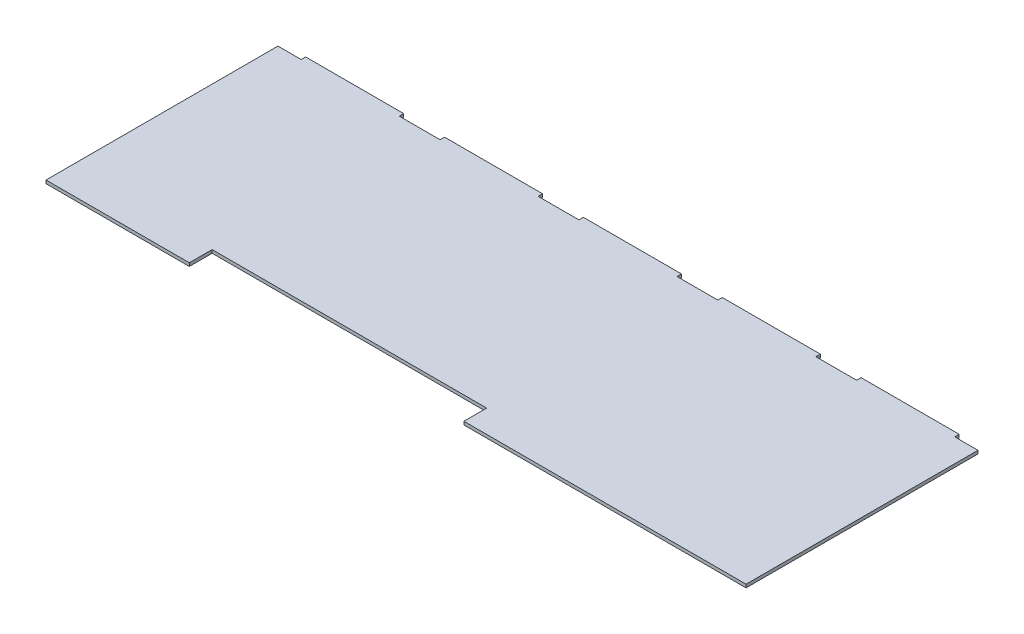
ISO-10303-21;
HEADER;
FILE_DESCRIPTION(('STEP AP214'),'2;1');
FILE_NAME('part.step','',(''),(''),'','','');
FILE_SCHEMA(('AUTOMOTIVE_DESIGN { 1 0 10303 214 1 1 1 1 }'));
ENDSEC;
DATA;
#1=APPLICATION_CONTEXT('core data for automotive mechanical design processes');
#2=APPLICATION_PROTOCOL_DEFINITION('international standard','automotive_design',2000,#1);
#3=PRODUCT_CONTEXT('',#1,'mechanical');
#4=PRODUCT('Part','Part','',(#3));
#5=PRODUCT_RELATED_PRODUCT_CATEGORY('part','',(#4));
#6=PRODUCT_DEFINITION_FORMATION('','',#4);
#7=PRODUCT_DEFINITION_CONTEXT('part definition',#1,'design');
#8=PRODUCT_DEFINITION('design','',#6,#7);
#9=PRODUCT_DEFINITION_SHAPE('','',#8);
#10=(LENGTH_UNIT() NAMED_UNIT(*) SI_UNIT(.MILLI.,.METRE.));
#11=(NAMED_UNIT(*) PLANE_ANGLE_UNIT() SI_UNIT($,.RADIAN.));
#12=(NAMED_UNIT(*) SI_UNIT($,.STERADIAN.) SOLID_ANGLE_UNIT());
#13=UNCERTAINTY_MEASURE_WITH_UNIT(LENGTH_MEASURE(1.E-05),#10,'distance_accuracy_value','');
#14=(GEOMETRIC_REPRESENTATION_CONTEXT(3) GLOBAL_UNCERTAINTY_ASSIGNED_CONTEXT((#13)) GLOBAL_UNIT_ASSIGNED_CONTEXT((#10,
#11,#12)) REPRESENTATION_CONTEXT('',''));
#15=CARTESIAN_POINT('',(0.,0.,0.));
#16=DIRECTION('',(0.,0.,1.));
#17=DIRECTION('',(1.,0.,0.));
#18=AXIS2_PLACEMENT_3D('',#15,#16,#17);
#19=CARTESIAN_POINT('',(-249.174,1.143,82.55));
#20=DIRECTION('',(0.,0.,-1.));
#21=DIRECTION('',(-1.,0.,0.));
#22=AXIS2_PLACEMENT_3D('',#19,#20,#21);
#23=PLANE('',#22);
#24=DIRECTION('',(0.,-1.,0.));
#25=VECTOR('',#24,1.);
#26=CARTESIAN_POINT('',(48.285399999999,1.14300000000078,82.55));
#27=LINE('',#26,#25);
#28=CARTESIAN_POINT('',(48.285399999999,1.14300000000078,82.55));
#29=VERTEX_POINT('',#28);
#30=CARTESIAN_POINT('',(48.285399999999,-1.143,82.55));
#31=VERTEX_POINT('',#30);
#32=EDGE_CURVE('E268',#29,#31,#27,.T.);
#33=ORIENTED_EDGE('',*,*,#32,.T.);
#34=DIRECTION('',(1.,0.,0.));
#35=VECTOR('',#34,1.);
#36=CARTESIAN_POINT('',(-249.174,-1.143,82.55));
#37=LINE('',#36,#35);
#38=CARTESIAN_POINT('',(249.174,-1.143,82.55));
#39=VERTEX_POINT('',#38);
#40=EDGE_CURVE('E486',#31,#39,#37,.T.);
#41=ORIENTED_EDGE('',*,*,#40,.T.);
#42=DIRECTION('',(0.,-1.,0.));
#43=VECTOR('',#42,1.);
#44=CARTESIAN_POINT('',(249.174,1.143,82.55));
#45=LINE('',#44,#43);
#46=CARTESIAN_POINT('',(249.174,1.143,82.55));
#47=VERTEX_POINT('',#46);
#48=EDGE_CURVE('E474',#47,#39,#45,.T.);
#49=ORIENTED_EDGE('',*,*,#48,.F.);
#50=DIRECTION('',(1.,0.,0.));
#51=VECTOR('',#50,1.);
#52=CARTESIAN_POINT('',(-249.174,1.143,82.55));
#53=LINE('',#52,#51);
#54=EDGE_CURVE('E471',#29,#47,#53,.T.);
#55=ORIENTED_EDGE('',*,*,#54,.F.);
#56=EDGE_LOOP('',(#33,#41,#49,#55));
#57=FACE_BOUND('',#56,.T.);
#58=ADVANCED_FACE('F41',(#57),#23,.F.);
#59=CARTESIAN_POINT('',(-249.174,1.143,-82.55));
#60=DIRECTION('',(0.,0.,1.));
#61=DIRECTION('',(1.,0.,0.));
#62=AXIS2_PLACEMENT_3D('',#59,#60,#61);
#63=PLANE('',#62);
#64=DIRECTION('',(0.,1.,0.));
#65=VECTOR('',#64,1.);
#66=CARTESIAN_POINT('',(-232.6386,1.14300000000078,-82.55));
#67=LINE('',#66,#65);
#68=CARTESIAN_POINT('',(-232.6386,-1.14299999999922,-82.55));
#69=VERTEX_POINT('',#68);
#70=CARTESIAN_POINT('',(-232.6386,1.143,-82.55));
#71=VERTEX_POINT('',#70);
#72=EDGE_CURVE('E267',#69,#71,#67,.T.);
#73=ORIENTED_EDGE('',*,*,#72,.F.);
#74=DIRECTION('',(-1.,0.,0.));
#75=VECTOR('',#74,1.);
#76=CARTESIAN_POINT('',(-249.174,-1.143,-82.55));
#77=LINE('',#76,#75);
#78=CARTESIAN_POINT('',(-249.174,-1.143,-82.55));
#79=VERTEX_POINT('',#78);
#80=EDGE_CURVE('E478',#69,#79,#77,.T.);
#81=ORIENTED_EDGE('',*,*,#80,.T.);
#82=DIRECTION('',(0.,-1.,0.));
#83=VECTOR('',#82,1.);
#84=CARTESIAN_POINT('',(-249.174,1.143,-82.55));
#85=LINE('',#84,#83);
#86=CARTESIAN_POINT('',(-249.174,1.143,-82.55));
#87=VERTEX_POINT('',#86);
#88=EDGE_CURVE('E50',#87,#79,#85,.T.);
#89=ORIENTED_EDGE('',*,*,#88,.F.);
#90=DIRECTION('',(-1.,0.,0.));
#91=VECTOR('',#90,1.);
#92=CARTESIAN_POINT('',(-249.174,1.143,-82.55));
#93=LINE('',#92,#91);
#94=EDGE_CURVE('E65',#71,#87,#93,.T.);
#95=ORIENTED_EDGE('',*,*,#94,.F.);
#96=EDGE_LOOP('',(#73,#81,#89,#95));
#97=FACE_BOUND('',#96,.T.);
#98=ADVANCED_FACE('F519',(#97),#63,.F.);
#99=DIRECTION('',(0.,-1.,0.));
#100=VECTOR('',#99,1.);
#101=CARTESIAN_POINT('',(-162.7886,-1.14299999999945,-82.55));
#102=LINE('',#101,#100);
#103=CARTESIAN_POINT('',(-162.7886,1.143,-82.55));
#104=VERTEX_POINT('',#103);
#105=CARTESIAN_POINT('',(-162.7886,-1.143,-82.55));
#106=VERTEX_POINT('',#105);
#107=EDGE_CURVE('E279',#104,#106,#102,.T.);
#108=ORIENTED_EDGE('',*,*,#107,.F.);
#109=CARTESIAN_POINT('',(-133.7818,1.143,-82.55));
#110=VERTEX_POINT('',#109);
#111=EDGE_CURVE('E555',#110,#104,#93,.T.);
#112=ORIENTED_EDGE('',*,*,#111,.F.);
#113=DIRECTION('',(0.,1.,0.));
#114=VECTOR('',#113,1.);
#115=CARTESIAN_POINT('',(-133.7818,1.14300000000044,-82.55));
#116=LINE('',#115,#114);
#117=CARTESIAN_POINT('',(-133.7818,-1.14299999999956,-82.55));
#118=VERTEX_POINT('',#117);
#119=EDGE_CURVE('E309',#118,#110,#116,.T.);
#120=ORIENTED_EDGE('',*,*,#119,.F.);
#121=EDGE_CURVE('E538',#118,#106,#77,.T.);
#122=ORIENTED_EDGE('',*,*,#121,.T.);
#123=EDGE_LOOP('',(#108,#112,#120,#122));
#124=FACE_BOUND('',#123,.T.);
#125=ADVANCED_FACE('F524',(#124),#63,.F.);
#126=DIRECTION('',(0.,-1.,0.));
#127=VECTOR('',#126,1.);
#128=CARTESIAN_POINT('',(-63.9318000000001,-1.1429999999998,-82.55));
#129=LINE('',#128,#127);
#130=CARTESIAN_POINT('',(-63.9318000000001,1.143,-82.55));
#131=VERTEX_POINT('',#130);
#132=CARTESIAN_POINT('',(-63.9318000000001,-1.143,-82.55));
#133=VERTEX_POINT('',#132);
#134=EDGE_CURVE('E315',#131,#133,#129,.T.);
#135=ORIENTED_EDGE('',*,*,#134,.F.);
#136=CARTESIAN_POINT('',(-34.9250000000001,1.143,-82.55));
#137=VERTEX_POINT('',#136);
#138=EDGE_CURVE('E559',#137,#131,#93,.T.);
#139=ORIENTED_EDGE('',*,*,#138,.F.);
#140=DIRECTION('',(0.,1.,0.));
#141=VECTOR('',#140,1.);
#142=CARTESIAN_POINT('',(-34.925,1.14300000000009,-82.55));
#143=LINE('',#142,#141);
#144=CARTESIAN_POINT('',(-34.925,-1.14299999999991,-82.55));
#145=VERTEX_POINT('',#144);
#146=EDGE_CURVE('E346',#145,#137,#143,.T.);
#147=ORIENTED_EDGE('',*,*,#146,.F.);
#148=EDGE_CURVE('E536',#145,#133,#77,.T.);
#149=ORIENTED_EDGE('',*,*,#148,.T.);
#150=EDGE_LOOP('',(#135,#139,#147,#149));
#151=FACE_BOUND('',#150,.T.);
#152=ADVANCED_FACE('F603',(#151),#63,.F.);
#153=DIRECTION('',(0.,-1.,0.));
#154=VECTOR('',#153,1.);
#155=CARTESIAN_POINT('',(34.925,-1.14300000000014,-82.55));
#156=LINE('',#155,#154);
#157=CARTESIAN_POINT('',(34.9249999999998,1.143,-82.55));
#158=VERTEX_POINT('',#157);
#159=CARTESIAN_POINT('',(34.9249999999998,-1.143,-82.55));
#160=VERTEX_POINT('',#159);
#161=EDGE_CURVE('E352',#158,#160,#156,.T.);
#162=ORIENTED_EDGE('',*,*,#161,.F.);
#163=CARTESIAN_POINT('',(63.9317999999998,1.143,-82.55));
#164=VERTEX_POINT('',#163);
#165=EDGE_CURVE('E563',#164,#158,#93,.T.);
#166=ORIENTED_EDGE('',*,*,#165,.F.);
#167=DIRECTION('',(0.,1.,0.));
#168=VECTOR('',#167,1.);
#169=CARTESIAN_POINT('',(63.9318,1.14299999999975,-82.55));
#170=LINE('',#169,#168);
#171=CARTESIAN_POINT('',(63.9318,-1.14300000000025,-82.55));
#172=VERTEX_POINT('',#171);
#173=EDGE_CURVE('E383',#172,#164,#170,.T.);
#174=ORIENTED_EDGE('',*,*,#173,.F.);
#175=EDGE_CURVE('E534',#172,#160,#77,.T.);
#176=ORIENTED_EDGE('',*,*,#175,.T.);
#177=EDGE_LOOP('',(#162,#166,#174,#176));
#178=FACE_BOUND('',#177,.T.);
#179=ADVANCED_FACE('F588',(#178),#63,.F.);
#180=DIRECTION('',(0.,-1.,0.));
#181=VECTOR('',#180,1.);
#182=CARTESIAN_POINT('',(133.7818,-1.14300000000049,-82.55));
#183=LINE('',#182,#181);
#184=CARTESIAN_POINT('',(133.7818,1.143,-82.55));
#185=VERTEX_POINT('',#184);
#186=CARTESIAN_POINT('',(133.7818,-1.143,-82.55));
#187=VERTEX_POINT('',#186);
#188=EDGE_CURVE('E389',#185,#187,#183,.T.);
#189=ORIENTED_EDGE('',*,*,#188,.F.);
#190=CARTESIAN_POINT('',(162.7886,1.1429999999994,-82.55));
#191=VERTEX_POINT('',#190);
#192=EDGE_CURVE('E468',#191,#185,#93,.T.);
#193=ORIENTED_EDGE('',*,*,#192,.F.);
#194=DIRECTION('',(0.,1.,0.));
#195=VECTOR('',#194,1.);
#196=CARTESIAN_POINT('',(162.7886,1.1429999999994,-82.55));
#197=LINE('',#196,#195);
#198=CARTESIAN_POINT('',(162.7886,-1.143,-82.55));
#199=VERTEX_POINT('',#198);
#200=EDGE_CURVE('E420',#199,#191,#197,.T.);
#201=ORIENTED_EDGE('',*,*,#200,.F.);
#202=EDGE_CURVE('E483',#199,#187,#77,.T.);
#203=ORIENTED_EDGE('',*,*,#202,.T.);
#204=EDGE_LOOP('',(#189,#193,#201,#203));
#205=FACE_BOUND('',#204,.T.);
#206=ADVANCED_FACE('F784',(#205),#63,.F.);
#207=DIRECTION('',(0.,-1.,0.));
#208=VECTOR('',#207,1.);
#209=CARTESIAN_POINT('',(232.6386,-1.14300000000083,-82.55));
#210=LINE('',#209,#208);
#211=CARTESIAN_POINT('',(232.6386,1.143,-82.55));
#212=VERTEX_POINT('',#211);
#213=CARTESIAN_POINT('',(232.6386,-1.143,-82.55));
#214=VERTEX_POINT('',#213);
#215=EDGE_CURVE('E426',#212,#214,#210,.T.);
#216=ORIENTED_EDGE('',*,*,#215,.F.);
#217=CARTESIAN_POINT('',(249.174,1.143,-82.55));
#218=VERTEX_POINT('',#217);
#219=EDGE_CURVE('E463',#218,#212,#93,.T.);
#220=ORIENTED_EDGE('',*,*,#219,.F.);
#221=DIRECTION('',(0.,-1.,0.));
#222=VECTOR('',#221,1.);
#223=CARTESIAN_POINT('',(249.174,1.143,-82.55));
#224=LINE('',#223,#222);
#225=CARTESIAN_POINT('',(249.174,-1.143,-82.55));
#226=VERTEX_POINT('',#225);
#227=EDGE_CURVE('E11',#218,#226,#224,.T.);
#228=ORIENTED_EDGE('',*,*,#227,.T.);
#229=EDGE_CURVE('E479',#226,#214,#77,.T.);
#230=ORIENTED_EDGE('',*,*,#229,.T.);
#231=EDGE_LOOP('',(#216,#220,#228,#230));
#232=FACE_BOUND('',#231,.T.);
#233=ADVANCED_FACE('F525',(#232),#63,.F.);
#234=CARTESIAN_POINT('',(249.174,1.143,-82.55));
#235=DIRECTION('',(-1.,0.,0.));
#236=DIRECTION('',(0.,0.,1.));
#237=AXIS2_PLACEMENT_3D('',#234,#235,#236);
#238=PLANE('',#237);
#239=DIRECTION('',(0.,0.,-1.));
#240=VECTOR('',#239,1.);
#241=CARTESIAN_POINT('',(249.174,-1.143,-82.55));
#242=LINE('',#241,#240);
#243=EDGE_CURVE('E457',#39,#226,#242,.T.);
#244=ORIENTED_EDGE('',*,*,#243,.T.);
#245=ORIENTED_EDGE('',*,*,#227,.F.);
#246=DIRECTION('',(0.,0.,-1.));
#247=VECTOR('',#246,1.);
#248=CARTESIAN_POINT('',(249.174,1.143,-82.55));
#249=LINE('',#248,#247);
#250=EDGE_CURVE('E458',#47,#218,#249,.T.);
#251=ORIENTED_EDGE('',*,*,#250,.F.);
#252=ORIENTED_EDGE('',*,*,#48,.T.);
#253=EDGE_LOOP('',(#244,#245,#251,#252));
#254=FACE_BOUND('',#253,.T.);
#255=ADVANCED_FACE('F43',(#254),#238,.F.);
#256=CARTESIAN_POINT('',(-249.174,1.143,-82.55));
#257=DIRECTION('',(1.,0.,0.));
#258=DIRECTION('',(0.,0.,-1.));
#259=AXIS2_PLACEMENT_3D('',#256,#257,#258);
#260=PLANE('',#259);
#261=DIRECTION('',(0.,0.,1.));
#262=VECTOR('',#261,1.);
#263=CARTESIAN_POINT('',(-249.174,-1.143,-82.55));
#264=LINE('',#263,#262);
#265=CARTESIAN_POINT('',(-249.174,-1.143,82.55));
#266=VERTEX_POINT('',#265);
#267=EDGE_CURVE('E482',#79,#266,#264,.T.);
#268=ORIENTED_EDGE('',*,*,#267,.T.);
#269=DIRECTION('',(0.,-1.,0.));
#270=VECTOR('',#269,1.);
#271=CARTESIAN_POINT('',(-249.174,1.143,82.55));
#272=LINE('',#271,#270);
#273=CARTESIAN_POINT('',(-249.174,1.143,82.55));
#274=VERTEX_POINT('',#273);
#275=EDGE_CURVE('E493',#274,#266,#272,.T.);
#276=ORIENTED_EDGE('',*,*,#275,.F.);
#277=DIRECTION('',(0.,0.,1.));
#278=VECTOR('',#277,1.);
#279=CARTESIAN_POINT('',(-249.174,1.143,-82.55));
#280=LINE('',#279,#278);
#281=EDGE_CURVE('E467',#87,#274,#280,.T.);
#282=ORIENTED_EDGE('',*,*,#281,.F.);
#283=ORIENTED_EDGE('',*,*,#88,.T.);
#284=EDGE_LOOP('',(#268,#276,#282,#283));
#285=FACE_BOUND('',#284,.T.);
#286=ADVANCED_FACE('F501',(#285),#260,.F.);
#287=CARTESIAN_POINT('',(-147.142200000001,-1.143,82.55));
#288=VERTEX_POINT('',#287);
#289=EDGE_CURVE('E462',#266,#288,#37,.T.);
#290=ORIENTED_EDGE('',*,*,#289,.T.);
#291=DIRECTION('',(0.,-1.,0.));
#292=VECTOR('',#291,1.);
#293=CARTESIAN_POINT('',(-147.142200000001,1.14300000000078,82.55));
#294=LINE('',#293,#292);
#295=CARTESIAN_POINT('',(-147.142200000001,1.14300000000078,82.55));
#296=VERTEX_POINT('',#295);
#297=EDGE_CURVE('E264',#296,#288,#294,.T.);
#298=ORIENTED_EDGE('',*,*,#297,.F.);
#299=EDGE_CURVE('E249',#274,#296,#53,.T.);
#300=ORIENTED_EDGE('',*,*,#299,.F.);
#301=ORIENTED_EDGE('',*,*,#275,.T.);
#302=EDGE_LOOP('',(#290,#298,#300,#301));
#303=FACE_BOUND('',#302,.T.);
#304=ADVANCED_FACE('F508',(#303),#23,.F.);
#305=CARTESIAN_POINT('',(0.,1.143,0.));
#306=DIRECTION('',(0.,1.,0.));
#307=DIRECTION('',(0.,0.,1.));
#308=AXIS2_PLACEMENT_3D('',#305,#306,#307);
#309=PLANE('',#308);
#310=DIRECTION('',(0.,0.,-1.));
#311=VECTOR('',#310,1.);
#312=CARTESIAN_POINT('',(-147.142200000001,1.14300000000078,0.));
#313=LINE('',#312,#311);
#314=CARTESIAN_POINT('',(-147.142200000001,1.14300000000078,66.3102308054884));
#315=VERTEX_POINT('',#314);
#316=EDGE_CURVE('E229',#296,#315,#313,.T.);
#317=ORIENTED_EDGE('',*,*,#316,.T.);
#318=DIRECTION('',(1.,0.,0.));
#319=VECTOR('',#318,1.);
#320=CARTESIAN_POINT('',(0.,1.14300000000078,66.3102308054884));
#321=LINE('',#320,#319);
#322=CARTESIAN_POINT('',(48.285399999999,1.14300000000078,66.3102308054884));
#323=VERTEX_POINT('',#322);
#324=EDGE_CURVE('E240',#315,#323,#321,.T.);
#325=ORIENTED_EDGE('',*,*,#324,.T.);
#326=DIRECTION('',(0.,0.,-1.));
#327=VECTOR('',#326,1.);
#328=CARTESIAN_POINT('',(48.285399999999,1.14300000000078,0.));
#329=LINE('',#328,#327);
#330=EDGE_CURVE('E236',#29,#323,#329,.T.);
#331=ORIENTED_EDGE('',*,*,#330,.F.);
#332=ORIENTED_EDGE('',*,*,#54,.T.);
#333=ORIENTED_EDGE('',*,*,#250,.T.);
#334=ORIENTED_EDGE('',*,*,#219,.T.);
#335=DIRECTION('',(0.,0.,1.));
#336=VECTOR('',#335,1.);
#337=CARTESIAN_POINT('',(232.6386,1.14299999999917,-85.725));
#338=LINE('',#337,#336);
#339=CARTESIAN_POINT('',(232.6386,1.14299999999917,-85.725));
#340=VERTEX_POINT('',#339);
#341=EDGE_CURVE('E445',#340,#212,#338,.T.);
#342=ORIENTED_EDGE('',*,*,#341,.F.);
#343=DIRECTION('',(1.,0.,0.));
#344=VECTOR('',#343,1.);
#345=CARTESIAN_POINT('',(232.6386,1.14299999999917,-85.725));
#346=LINE('',#345,#344);
#347=CARTESIAN_POINT('',(162.7886,1.1429999999994,-85.725));
#348=VERTEX_POINT('',#347);
#349=EDGE_CURVE('E429',#348,#340,#346,.T.);
#350=ORIENTED_EDGE('',*,*,#349,.F.);
#351=DIRECTION('',(0.,0.,1.));
#352=VECTOR('',#351,1.);
#353=CARTESIAN_POINT('',(162.7886,1.1429999999994,-85.725));
#354=LINE('',#353,#352);
#355=EDGE_CURVE('E449',#348,#191,#354,.T.);
#356=ORIENTED_EDGE('',*,*,#355,.T.);
#357=ORIENTED_EDGE('',*,*,#192,.T.);
#358=DIRECTION('',(0.,0.,1.));
#359=VECTOR('',#358,1.);
#360=CARTESIAN_POINT('',(133.7818,1.14299999999951,-85.725));
#361=LINE('',#360,#359);
#362=CARTESIAN_POINT('',(133.7818,1.14299999999951,-85.725));
#363=VERTEX_POINT('',#362);
#364=EDGE_CURVE('E408',#363,#185,#361,.T.);
#365=ORIENTED_EDGE('',*,*,#364,.F.);
#366=DIRECTION('',(1.,0.,0.));
#367=VECTOR('',#366,1.);
#368=CARTESIAN_POINT('',(133.7818,1.14299999999951,-85.725));
#369=LINE('',#368,#367);
#370=CARTESIAN_POINT('',(63.9318,1.14299999999975,-85.725));
#371=VERTEX_POINT('',#370);
#372=EDGE_CURVE('E392',#371,#363,#369,.T.);
#373=ORIENTED_EDGE('',*,*,#372,.F.);
#374=DIRECTION('',(0.,0.,1.));
#375=VECTOR('',#374,1.);
#376=CARTESIAN_POINT('',(63.9318,1.14299999999975,-85.725));
#377=LINE('',#376,#375);
#378=EDGE_CURVE('E412',#371,#164,#377,.T.);
#379=ORIENTED_EDGE('',*,*,#378,.T.);
#380=ORIENTED_EDGE('',*,*,#165,.T.);
#381=DIRECTION('',(0.,0.,1.));
#382=VECTOR('',#381,1.);
#383=CARTESIAN_POINT('',(34.925,1.14299999999986,-85.725));
#384=LINE('',#383,#382);
#385=CARTESIAN_POINT('',(34.925,1.14299999999986,-85.725));
#386=VERTEX_POINT('',#385);
#387=EDGE_CURVE('E371',#386,#158,#384,.T.);
#388=ORIENTED_EDGE('',*,*,#387,.F.);
#389=DIRECTION('',(1.,0.,0.));
#390=VECTOR('',#389,1.);
#391=CARTESIAN_POINT('',(34.925,1.14299999999986,-85.725));
#392=LINE('',#391,#390);
#393=CARTESIAN_POINT('',(-34.925,1.14300000000009,-85.725));
#394=VERTEX_POINT('',#393);
#395=EDGE_CURVE('E355',#394,#386,#392,.T.);
#396=ORIENTED_EDGE('',*,*,#395,.F.);
#397=DIRECTION('',(0.,0.,1.));
#398=VECTOR('',#397,1.);
#399=CARTESIAN_POINT('',(-34.925,1.14300000000009,-85.725));
#400=LINE('',#399,#398);
#401=EDGE_CURVE('E375',#394,#137,#400,.T.);
#402=ORIENTED_EDGE('',*,*,#401,.T.);
#403=ORIENTED_EDGE('',*,*,#138,.T.);
#404=DIRECTION('',(0.,0.,1.));
#405=VECTOR('',#404,1.);
#406=CARTESIAN_POINT('',(-63.9318000000001,1.1430000000002,-85.725));
#407=LINE('',#406,#405);
#408=CARTESIAN_POINT('',(-63.9318000000001,1.1430000000002,-85.725));
#409=VERTEX_POINT('',#408);
#410=EDGE_CURVE('E334',#409,#131,#407,.T.);
#411=ORIENTED_EDGE('',*,*,#410,.F.);
#412=DIRECTION('',(1.,0.,0.));
#413=VECTOR('',#412,1.);
#414=CARTESIAN_POINT('',(-63.9318000000001,1.1430000000002,-85.725));
#415=LINE('',#414,#413);
#416=CARTESIAN_POINT('',(-133.7818,1.14300000000044,-85.725));
#417=VERTEX_POINT('',#416);
#418=EDGE_CURVE('E318',#417,#409,#415,.T.);
#419=ORIENTED_EDGE('',*,*,#418,.F.);
#420=DIRECTION('',(0.,0.,1.));
#421=VECTOR('',#420,1.);
#422=CARTESIAN_POINT('',(-133.7818,1.14300000000044,-85.725));
#423=LINE('',#422,#421);
#424=EDGE_CURVE('E338',#417,#110,#423,.T.);
#425=ORIENTED_EDGE('',*,*,#424,.T.);
#426=ORIENTED_EDGE('',*,*,#111,.T.);
#427=DIRECTION('',(0.,0.,1.));
#428=VECTOR('',#427,1.);
#429=CARTESIAN_POINT('',(-162.7886,1.14300000000055,-85.725));
#430=LINE('',#429,#428);
#431=CARTESIAN_POINT('',(-162.7886,1.14300000000055,-85.725));
#432=VERTEX_POINT('',#431);
#433=EDGE_CURVE('E297',#432,#104,#430,.T.);
#434=ORIENTED_EDGE('',*,*,#433,.F.);
#435=DIRECTION('',(1.,0.,0.));
#436=VECTOR('',#435,1.);
#437=CARTESIAN_POINT('',(-162.7886,1.14300000000055,-85.725));
#438=LINE('',#437,#436);
#439=CARTESIAN_POINT('',(-232.6386,1.14300000000078,-85.725));
#440=VERTEX_POINT('',#439);
#441=EDGE_CURVE('E282',#440,#432,#438,.T.);
#442=ORIENTED_EDGE('',*,*,#441,.F.);
#443=DIRECTION('',(0.,0.,1.));
#444=VECTOR('',#443,1.);
#445=CARTESIAN_POINT('',(-232.6386,1.14300000000078,-85.725));
#446=LINE('',#445,#444);
#447=EDGE_CURVE('E301',#440,#71,#446,.T.);
#448=ORIENTED_EDGE('',*,*,#447,.T.);
#449=ORIENTED_EDGE('',*,*,#94,.T.);
#450=ORIENTED_EDGE('',*,*,#281,.T.);
#451=ORIENTED_EDGE('',*,*,#299,.T.);
#452=EDGE_LOOP('',(#317,#325,#331,#332,#333,#334,#342,#350,#356,#357,#365,#373,#379,#380,#388,
#396,#402,#403,#411,#419,#425,#426,#434,#442,#448,#449,#450,#451));
#453=FACE_BOUND('',#452,.T.);
#454=ADVANCED_FACE('F247',(#453),#309,.T.);
#455=CARTESIAN_POINT('',(0.,-1.143,0.));
#456=DIRECTION('',(0.,1.,0.));
#457=DIRECTION('',(0.,0.,1.));
#458=AXIS2_PLACEMENT_3D('',#455,#456,#457);
#459=PLANE('',#458);
#460=DIRECTION('',(1.,0.,0.));
#461=VECTOR('',#460,1.);
#462=CARTESIAN_POINT('',(0.,-1.143,66.3102308054884));
#463=LINE('',#462,#461);
#464=CARTESIAN_POINT('',(-147.142200000001,-1.143,66.3102308054884));
#465=VERTEX_POINT('',#464);
#466=CARTESIAN_POINT('',(48.285399999999,-1.143,66.3102308054884));
#467=VERTEX_POINT('',#466);
#468=EDGE_CURVE('E255',#465,#467,#463,.T.);
#469=ORIENTED_EDGE('',*,*,#468,.F.);
#470=DIRECTION('',(0.,0.,-1.));
#471=VECTOR('',#470,1.);
#472=CARTESIAN_POINT('',(-147.142200000001,-1.143,0.));
#473=LINE('',#472,#471);
#474=EDGE_CURVE('E57',#288,#465,#473,.T.);
#475=ORIENTED_EDGE('',*,*,#474,.F.);
#476=ORIENTED_EDGE('',*,*,#289,.F.);
#477=ORIENTED_EDGE('',*,*,#267,.F.);
#478=ORIENTED_EDGE('',*,*,#80,.F.);
#479=DIRECTION('',(0.,0.,1.));
#480=VECTOR('',#479,1.);
#481=CARTESIAN_POINT('',(-232.6386,-1.14299999999922,-85.725));
#482=LINE('',#481,#480);
#483=CARTESIAN_POINT('',(-232.6386,-1.14299999999922,-85.725));
#484=VERTEX_POINT('',#483);
#485=EDGE_CURVE('E305',#484,#69,#482,.T.);
#486=ORIENTED_EDGE('',*,*,#485,.F.);
#487=DIRECTION('',(-1.,0.,0.));
#488=VECTOR('',#487,1.);
#489=CARTESIAN_POINT('',(-232.6386,-1.14299999999922,-85.725));
#490=LINE('',#489,#488);
#491=CARTESIAN_POINT('',(-162.7886,-1.14299999999945,-85.725));
#492=VERTEX_POINT('',#491);
#493=EDGE_CURVE('E274',#492,#484,#490,.T.);
#494=ORIENTED_EDGE('',*,*,#493,.F.);
#495=DIRECTION('',(0.,0.,1.));
#496=VECTOR('',#495,1.);
#497=CARTESIAN_POINT('',(-162.7886,-1.14299999999945,-85.725));
#498=LINE('',#497,#496);
#499=EDGE_CURVE('E288',#492,#106,#498,.T.);
#500=ORIENTED_EDGE('',*,*,#499,.T.);
#501=ORIENTED_EDGE('',*,*,#121,.F.);
#502=DIRECTION('',(0.,0.,1.));
#503=VECTOR('',#502,1.);
#504=CARTESIAN_POINT('',(-133.7818,-1.14299999999956,-85.725));
#505=LINE('',#504,#503);
#506=CARTESIAN_POINT('',(-133.7818,-1.14299999999956,-85.725));
#507=VERTEX_POINT('',#506);
#508=EDGE_CURVE('E342',#507,#118,#505,.T.);
#509=ORIENTED_EDGE('',*,*,#508,.F.);
#510=DIRECTION('',(-1.,0.,0.));
#511=VECTOR('',#510,1.);
#512=CARTESIAN_POINT('',(-133.7818,-1.14299999999956,-85.725));
#513=LINE('',#512,#511);
#514=CARTESIAN_POINT('',(-63.9318000000001,-1.1429999999998,-85.725));
#515=VERTEX_POINT('',#514);
#516=EDGE_CURVE('E310',#515,#507,#513,.T.);
#517=ORIENTED_EDGE('',*,*,#516,.F.);
#518=DIRECTION('',(0.,0.,1.));
#519=VECTOR('',#518,1.);
#520=CARTESIAN_POINT('',(-63.9318000000001,-1.1429999999998,-85.725));
#521=LINE('',#520,#519);
#522=EDGE_CURVE('E324',#515,#133,#521,.T.);
#523=ORIENTED_EDGE('',*,*,#522,.T.);
#524=ORIENTED_EDGE('',*,*,#148,.F.);
#525=DIRECTION('',(0.,0.,1.));
#526=VECTOR('',#525,1.);
#527=CARTESIAN_POINT('',(-34.925,-1.14299999999991,-85.725));
#528=LINE('',#527,#526);
#529=CARTESIAN_POINT('',(-34.925,-1.14299999999991,-85.725));
#530=VERTEX_POINT('',#529);
#531=EDGE_CURVE('E379',#530,#145,#528,.T.);
#532=ORIENTED_EDGE('',*,*,#531,.F.);
#533=DIRECTION('',(-1.,0.,0.));
#534=VECTOR('',#533,1.);
#535=CARTESIAN_POINT('',(-34.925,-1.14299999999991,-85.725));
#536=LINE('',#535,#534);
#537=CARTESIAN_POINT('',(34.925,-1.14300000000014,-85.725));
#538=VERTEX_POINT('',#537);
#539=EDGE_CURVE('E347',#538,#530,#536,.T.);
#540=ORIENTED_EDGE('',*,*,#539,.F.);
#541=DIRECTION('',(0.,0.,1.));
#542=VECTOR('',#541,1.);
#543=CARTESIAN_POINT('',(34.925,-1.14300000000014,-85.725));
#544=LINE('',#543,#542);
#545=EDGE_CURVE('E361',#538,#160,#544,.T.);
#546=ORIENTED_EDGE('',*,*,#545,.T.);
#547=ORIENTED_EDGE('',*,*,#175,.F.);
#548=DIRECTION('',(0.,0.,1.));
#549=VECTOR('',#548,1.);
#550=CARTESIAN_POINT('',(63.9318,-1.14300000000025,-85.725));
#551=LINE('',#550,#549);
#552=CARTESIAN_POINT('',(63.9318,-1.14300000000025,-85.725));
#553=VERTEX_POINT('',#552);
#554=EDGE_CURVE('E416',#553,#172,#551,.T.);
#555=ORIENTED_EDGE('',*,*,#554,.F.);
#556=DIRECTION('',(-1.,0.,0.));
#557=VECTOR('',#556,1.);
#558=CARTESIAN_POINT('',(63.9318,-1.14300000000025,-85.725));
#559=LINE('',#558,#557);
#560=CARTESIAN_POINT('',(133.7818,-1.14300000000049,-85.725));
#561=VERTEX_POINT('',#560);
#562=EDGE_CURVE('E384',#561,#553,#559,.T.);
#563=ORIENTED_EDGE('',*,*,#562,.F.);
#564=DIRECTION('',(0.,0.,1.));
#565=VECTOR('',#564,1.);
#566=CARTESIAN_POINT('',(133.7818,-1.14300000000049,-85.725));
#567=LINE('',#566,#565);
#568=EDGE_CURVE('E398',#561,#187,#567,.T.);
#569=ORIENTED_EDGE('',*,*,#568,.T.);
#570=ORIENTED_EDGE('',*,*,#202,.F.);
#571=DIRECTION('',(0.,0.,1.));
#572=VECTOR('',#571,1.);
#573=CARTESIAN_POINT('',(162.7886,-1.1430000000006,-85.725));
#574=LINE('',#573,#572);
#575=CARTESIAN_POINT('',(162.7886,-1.1430000000006,-85.725));
#576=VERTEX_POINT('',#575);
#577=EDGE_CURVE('E453',#576,#199,#574,.T.);
#578=ORIENTED_EDGE('',*,*,#577,.F.);
#579=DIRECTION('',(-1.,0.,0.));
#580=VECTOR('',#579,1.);
#581=CARTESIAN_POINT('',(162.7886,-1.1430000000006,-85.725));
#582=LINE('',#581,#580);
#583=CARTESIAN_POINT('',(232.6386,-1.14300000000083,-85.725));
#584=VERTEX_POINT('',#583);
#585=EDGE_CURVE('E421',#584,#576,#582,.T.);
#586=ORIENTED_EDGE('',*,*,#585,.F.);
#587=DIRECTION('',(0.,0.,1.));
#588=VECTOR('',#587,1.);
#589=CARTESIAN_POINT('',(232.6386,-1.14300000000083,-85.725));
#590=LINE('',#589,#588);
#591=EDGE_CURVE('E435',#584,#214,#590,.T.);
#592=ORIENTED_EDGE('',*,*,#591,.T.);
#593=ORIENTED_EDGE('',*,*,#229,.F.);
#594=ORIENTED_EDGE('',*,*,#243,.F.);
#595=ORIENTED_EDGE('',*,*,#40,.F.);
#596=DIRECTION('',(0.,0.,-1.));
#597=VECTOR('',#596,1.);
#598=CARTESIAN_POINT('',(48.285399999999,-1.143,0.));
#599=LINE('',#598,#597);
#600=EDGE_CURVE('E251',#31,#467,#599,.T.);
#601=ORIENTED_EDGE('',*,*,#600,.T.);
#602=EDGE_LOOP('',(#469,#475,#476,#477,#478,#486,#494,#500,#501,#509,#517,#523,#524,#532,#540,
#546,#547,#555,#563,#569,#570,#578,#586,#592,#593,#594,#595,#601));
#603=FACE_BOUND('',#602,.T.);
#604=ADVANCED_FACE('F505',(#603),#459,.F.);
#605=CARTESIAN_POINT('',(162.7886,1.1429999999994,-85.725));
#606=DIRECTION('',(1.,0.,0.));
#607=DIRECTION('',(0.,0.,-1.));
#608=AXIS2_PLACEMENT_3D('',#605,#606,#607);
#609=PLANE('',#608);
#610=ORIENTED_EDGE('',*,*,#200,.T.);
#611=ORIENTED_EDGE('',*,*,#355,.F.);
#612=DIRECTION('',(0.,1.,0.));
#613=VECTOR('',#612,1.);
#614=CARTESIAN_POINT('',(162.7886,1.1429999999994,-85.725));
#615=LINE('',#614,#613);
#616=EDGE_CURVE('E425',#576,#348,#615,.T.);
#617=ORIENTED_EDGE('',*,*,#616,.F.);
#618=ORIENTED_EDGE('',*,*,#577,.T.);
#619=EDGE_LOOP('',(#610,#611,#617,#618));
#620=FACE_BOUND('',#619,.T.);
#621=ADVANCED_FACE('F641',(#620),#609,.F.);
#622=CARTESIAN_POINT('',(232.6386,-1.14300000000083,-85.725));
#623=DIRECTION('',(-1.,0.,0.));
#624=DIRECTION('',(0.,0.,1.));
#625=AXIS2_PLACEMENT_3D('',#622,#623,#624);
#626=PLANE('',#625);
#627=ORIENTED_EDGE('',*,*,#215,.T.);
#628=ORIENTED_EDGE('',*,*,#591,.F.);
#629=DIRECTION('',(0.,-1.,0.));
#630=VECTOR('',#629,1.);
#631=CARTESIAN_POINT('',(232.6386,-1.14300000000083,-85.725));
#632=LINE('',#631,#630);
#633=EDGE_CURVE('E432',#340,#584,#632,.T.);
#634=ORIENTED_EDGE('',*,*,#633,.F.);
#635=ORIENTED_EDGE('',*,*,#341,.T.);
#636=EDGE_LOOP('',(#627,#628,#634,#635));
#637=FACE_BOUND('',#636,.T.);
#638=ADVANCED_FACE('F637',(#637),#626,.F.);
#639=CARTESIAN_POINT('',(0.,0.,-85.725));
#640=DIRECTION('',(0.,0.,1.));
#641=DIRECTION('',(1.,0.,0.));
#642=AXIS2_PLACEMENT_3D('',#639,#640,#641);
#643=PLANE('',#642);
#644=ORIENTED_EDGE('',*,*,#585,.T.);
#645=ORIENTED_EDGE('',*,*,#616,.T.);
#646=ORIENTED_EDGE('',*,*,#349,.T.);
#647=ORIENTED_EDGE('',*,*,#633,.T.);
#648=EDGE_LOOP('',(#644,#645,#646,#647));
#649=FACE_BOUND('',#648,.T.);
#650=ADVANCED_FACE('F634',(#649),#643,.F.);
#651=CARTESIAN_POINT('',(63.9318,1.14299999999975,-85.725));
#652=DIRECTION('',(1.,0.,0.));
#653=DIRECTION('',(0.,0.,-1.));
#654=AXIS2_PLACEMENT_3D('',#651,#652,#653);
#655=PLANE('',#654);
#656=ORIENTED_EDGE('',*,*,#173,.T.);
#657=ORIENTED_EDGE('',*,*,#378,.F.);
#658=DIRECTION('',(0.,1.,0.));
#659=VECTOR('',#658,1.);
#660=CARTESIAN_POINT('',(63.9318,1.14299999999975,-85.725));
#661=LINE('',#660,#659);
#662=EDGE_CURVE('E388',#553,#371,#661,.T.);
#663=ORIENTED_EDGE('',*,*,#662,.F.);
#664=ORIENTED_EDGE('',*,*,#554,.T.);
#665=EDGE_LOOP('',(#656,#657,#663,#664));
#666=FACE_BOUND('',#665,.T.);
#667=ADVANCED_FACE('F585',(#666),#655,.F.);
#668=CARTESIAN_POINT('',(133.7818,-1.14300000000049,-85.725));
#669=DIRECTION('',(-1.,0.,0.));
#670=DIRECTION('',(0.,0.,1.));
#671=AXIS2_PLACEMENT_3D('',#668,#669,#670);
#672=PLANE('',#671);
#673=ORIENTED_EDGE('',*,*,#188,.T.);
#674=ORIENTED_EDGE('',*,*,#568,.F.);
#675=DIRECTION('',(0.,-1.,0.));
#676=VECTOR('',#675,1.);
#677=CARTESIAN_POINT('',(133.7818,-1.14300000000049,-85.725));
#678=LINE('',#677,#676);
#679=EDGE_CURVE('E395',#363,#561,#678,.T.);
#680=ORIENTED_EDGE('',*,*,#679,.F.);
#681=ORIENTED_EDGE('',*,*,#364,.T.);
#682=EDGE_LOOP('',(#673,#674,#680,#681));
#683=FACE_BOUND('',#682,.T.);
#684=ADVANCED_FACE('F577',(#683),#672,.F.);
#685=CARTESIAN_POINT('',(-98.8568,3.45156672417748E-13,-85.725));
#686=DIRECTION('',(0.,0.,1.));
#687=DIRECTION('',(1.,0.,0.));
#688=AXIS2_PLACEMENT_3D('',#685,#686,#687);
#689=PLANE('',#688);
#690=ORIENTED_EDGE('',*,*,#562,.T.);
#691=ORIENTED_EDGE('',*,*,#662,.T.);
#692=ORIENTED_EDGE('',*,*,#372,.T.);
#693=ORIENTED_EDGE('',*,*,#679,.T.);
#694=EDGE_LOOP('',(#690,#691,#692,#693));
#695=FACE_BOUND('',#694,.T.);
#696=ADVANCED_FACE('F581',(#695),#689,.F.);
#697=CARTESIAN_POINT('',(-34.925,1.14300000000009,-85.725));
#698=DIRECTION('',(1.,0.,0.));
#699=DIRECTION('',(0.,0.,-1.));
#700=AXIS2_PLACEMENT_3D('',#697,#698,#699);
#701=PLANE('',#700);
#702=ORIENTED_EDGE('',*,*,#146,.T.);
#703=ORIENTED_EDGE('',*,*,#401,.F.);
#704=DIRECTION('',(0.,1.,0.));
#705=VECTOR('',#704,1.);
#706=CARTESIAN_POINT('',(-34.925,1.14300000000009,-85.725));
#707=LINE('',#706,#705);
#708=EDGE_CURVE('E351',#530,#394,#707,.T.);
#709=ORIENTED_EDGE('',*,*,#708,.F.);
#710=ORIENTED_EDGE('',*,*,#531,.T.);
#711=EDGE_LOOP('',(#702,#703,#709,#710));
#712=FACE_BOUND('',#711,.T.);
#713=ADVANCED_FACE('F600',(#712),#701,.F.);
#714=CARTESIAN_POINT('',(34.925,-1.14300000000014,-85.725));
#715=DIRECTION('',(-1.,0.,0.));
#716=DIRECTION('',(0.,0.,1.));
#717=AXIS2_PLACEMENT_3D('',#714,#715,#716);
#718=PLANE('',#717);
#719=ORIENTED_EDGE('',*,*,#161,.T.);
#720=ORIENTED_EDGE('',*,*,#545,.F.);
#721=DIRECTION('',(0.,-1.,0.));
#722=VECTOR('',#721,1.);
#723=CARTESIAN_POINT('',(34.925,-1.14300000000014,-85.725));
#724=LINE('',#723,#722);
#725=EDGE_CURVE('E358',#386,#538,#724,.T.);
#726=ORIENTED_EDGE('',*,*,#725,.F.);
#727=ORIENTED_EDGE('',*,*,#387,.T.);
#728=EDGE_LOOP('',(#719,#720,#726,#727));
#729=FACE_BOUND('',#728,.T.);
#730=ADVANCED_FACE('F591',(#729),#718,.F.);
#731=CARTESIAN_POINT('',(-197.7136,6.90313344835496E-13,-85.725));
#732=DIRECTION('',(0.,0.,1.));
#733=DIRECTION('',(1.,0.,0.));
#734=AXIS2_PLACEMENT_3D('',#731,#732,#733);
#735=PLANE('',#734);
#736=ORIENTED_EDGE('',*,*,#539,.T.);
#737=ORIENTED_EDGE('',*,*,#708,.T.);
#738=ORIENTED_EDGE('',*,*,#395,.T.);
#739=ORIENTED_EDGE('',*,*,#725,.T.);
#740=EDGE_LOOP('',(#736,#737,#738,#739));
#741=FACE_BOUND('',#740,.T.);
#742=ADVANCED_FACE('F596',(#741),#735,.F.);
#743=CARTESIAN_POINT('',(-133.7818,1.14300000000044,-85.725));
#744=DIRECTION('',(1.,0.,0.));
#745=DIRECTION('',(0.,0.,-1.));
#746=AXIS2_PLACEMENT_3D('',#743,#744,#745);
#747=PLANE('',#746);
#748=ORIENTED_EDGE('',*,*,#119,.T.);
#749=ORIENTED_EDGE('',*,*,#424,.F.);
#750=DIRECTION('',(0.,1.,0.));
#751=VECTOR('',#750,1.);
#752=CARTESIAN_POINT('',(-133.7818,1.14300000000044,-85.725));
#753=LINE('',#752,#751);
#754=EDGE_CURVE('E314',#507,#417,#753,.T.);
#755=ORIENTED_EDGE('',*,*,#754,.F.);
#756=ORIENTED_EDGE('',*,*,#508,.T.);
#757=EDGE_LOOP('',(#748,#749,#755,#756));
#758=FACE_BOUND('',#757,.T.);
#759=ADVANCED_FACE('F613',(#758),#747,.F.);
#760=CARTESIAN_POINT('',(-63.9318000000001,-1.1429999999998,-85.725));
#761=DIRECTION('',(-1.,0.,0.));
#762=DIRECTION('',(0.,0.,1.));
#763=AXIS2_PLACEMENT_3D('',#760,#761,#762);
#764=PLANE('',#763);
#765=ORIENTED_EDGE('',*,*,#134,.T.);
#766=ORIENTED_EDGE('',*,*,#522,.F.);
#767=DIRECTION('',(0.,-1.,0.));
#768=VECTOR('',#767,1.);
#769=CARTESIAN_POINT('',(-63.9318000000001,-1.1429999999998,-85.725));
#770=LINE('',#769,#768);
#771=EDGE_CURVE('E321',#409,#515,#770,.T.);
#772=ORIENTED_EDGE('',*,*,#771,.F.);
#773=ORIENTED_EDGE('',*,*,#410,.T.);
#774=EDGE_LOOP('',(#765,#766,#772,#773));
#775=FACE_BOUND('',#774,.T.);
#776=ADVANCED_FACE('F606',(#775),#764,.F.);
#777=CARTESIAN_POINT('',(-296.5704,1.03547001725324E-12,-85.725));
#778=DIRECTION('',(0.,0.,1.));
#779=DIRECTION('',(1.,0.,0.));
#780=AXIS2_PLACEMENT_3D('',#777,#778,#779);
#781=PLANE('',#780);
#782=ORIENTED_EDGE('',*,*,#516,.T.);
#783=ORIENTED_EDGE('',*,*,#754,.T.);
#784=ORIENTED_EDGE('',*,*,#418,.T.);
#785=ORIENTED_EDGE('',*,*,#771,.T.);
#786=EDGE_LOOP('',(#782,#783,#784,#785));
#787=FACE_BOUND('',#786,.T.);
#788=ADVANCED_FACE('F611',(#787),#781,.F.);
#789=CARTESIAN_POINT('',(-232.6386,1.14300000000078,-85.725));
#790=DIRECTION('',(1.,0.,0.));
#791=DIRECTION('',(0.,0.,-1.));
#792=AXIS2_PLACEMENT_3D('',#789,#790,#791);
#793=PLANE('',#792);
#794=ORIENTED_EDGE('',*,*,#72,.T.);
#795=ORIENTED_EDGE('',*,*,#447,.F.);
#796=DIRECTION('',(0.,1.,0.));
#797=VECTOR('',#796,1.);
#798=CARTESIAN_POINT('',(-232.6386,1.14300000000078,-85.725));
#799=LINE('',#798,#797);
#800=EDGE_CURVE('E278',#484,#440,#799,.T.);
#801=ORIENTED_EDGE('',*,*,#800,.F.);
#802=ORIENTED_EDGE('',*,*,#485,.T.);
#803=EDGE_LOOP('',(#794,#795,#801,#802));
#804=FACE_BOUND('',#803,.T.);
#805=ADVANCED_FACE('F542',(#804),#793,.F.);
#806=CARTESIAN_POINT('',(-162.7886,-1.14299999999945,-85.725));
#807=DIRECTION('',(-1.,0.,0.));
#808=DIRECTION('',(0.,0.,1.));
#809=AXIS2_PLACEMENT_3D('',#806,#807,#808);
#810=PLANE('',#809);
#811=ORIENTED_EDGE('',*,*,#107,.T.);
#812=ORIENTED_EDGE('',*,*,#499,.F.);
#813=DIRECTION('',(0.,-1.,0.));
#814=VECTOR('',#813,1.);
#815=CARTESIAN_POINT('',(-162.7886,-1.14299999999945,-85.725));
#816=LINE('',#815,#814);
#817=EDGE_CURVE('E285',#432,#492,#816,.T.);
#818=ORIENTED_EDGE('',*,*,#817,.F.);
#819=ORIENTED_EDGE('',*,*,#433,.T.);
#820=EDGE_LOOP('',(#811,#812,#818,#819));
#821=FACE_BOUND('',#820,.T.);
#822=ADVANCED_FACE('F551',(#821),#810,.F.);
#823=CARTESIAN_POINT('',(-395.4272,1.38062668967099E-12,-85.725));
#824=DIRECTION('',(0.,0.,1.));
#825=DIRECTION('',(1.,0.,0.));
#826=AXIS2_PLACEMENT_3D('',#823,#824,#825);
#827=PLANE('',#826);
#828=ORIENTED_EDGE('',*,*,#493,.T.);
#829=ORIENTED_EDGE('',*,*,#800,.T.);
#830=ORIENTED_EDGE('',*,*,#441,.T.);
#831=ORIENTED_EDGE('',*,*,#817,.T.);
#832=EDGE_LOOP('',(#828,#829,#830,#831));
#833=FACE_BOUND('',#832,.T.);
#834=ADVANCED_FACE('F546',(#833),#827,.F.);
#835=CARTESIAN_POINT('',(-147.142200000001,1.14300000000078,0.));
#836=DIRECTION('',(-1.,0.,0.));
#837=DIRECTION('',(0.,0.,1.));
#838=AXIS2_PLACEMENT_3D('',#835,#836,#837);
#839=PLANE('',#838);
#840=ORIENTED_EDGE('',*,*,#474,.T.);
#841=DIRECTION('',(0.,-1.,0.));
#842=VECTOR('',#841,1.);
#843=CARTESIAN_POINT('',(-147.142200000001,1.14300000000078,66.3102308054884));
#844=LINE('',#843,#842);
#845=EDGE_CURVE('E225',#315,#465,#844,.T.);
#846=ORIENTED_EDGE('',*,*,#845,.F.);
#847=ORIENTED_EDGE('',*,*,#316,.F.);
#848=ORIENTED_EDGE('',*,*,#297,.T.);
#849=EDGE_LOOP('',(#840,#846,#847,#848));
#850=FACE_BOUND('',#849,.T.);
#851=ADVANCED_FACE('F227',(#850),#839,.F.);
#852=CARTESIAN_POINT('',(48.285399999999,1.14300000000078,0.));
#853=DIRECTION('',(-1.,0.,0.));
#854=DIRECTION('',(0.,0.,1.));
#855=AXIS2_PLACEMENT_3D('',#852,#853,#854);
#856=PLANE('',#855);
#857=ORIENTED_EDGE('',*,*,#600,.F.);
#858=ORIENTED_EDGE('',*,*,#32,.F.);
#859=ORIENTED_EDGE('',*,*,#330,.T.);
#860=DIRECTION('',(0.,-1.,0.));
#861=VECTOR('',#860,1.);
#862=CARTESIAN_POINT('',(48.285399999999,1.14300000000078,66.3102308054884));
#863=LINE('',#862,#861);
#864=EDGE_CURVE('E235',#323,#467,#863,.T.);
#865=ORIENTED_EDGE('',*,*,#864,.T.);
#866=EDGE_LOOP('',(#857,#858,#859,#865));
#867=FACE_BOUND('',#866,.T.);
#868=ADVANCED_FACE('F836',(#867),#856,.T.);
#869=CARTESIAN_POINT('',(0.,1.14300000000078,66.3102308054884));
#870=DIRECTION('',(0.,0.,-1.));
#871=DIRECTION('',(-1.,0.,0.));
#872=AXIS2_PLACEMENT_3D('',#869,#870,#871);
#873=PLANE('',#872);
#874=ORIENTED_EDGE('',*,*,#468,.T.);
#875=ORIENTED_EDGE('',*,*,#864,.F.);
#876=ORIENTED_EDGE('',*,*,#324,.F.);
#877=ORIENTED_EDGE('',*,*,#845,.T.);
#878=EDGE_LOOP('',(#874,#875,#876,#877));
#879=FACE_BOUND('',#878,.T.);
#880=ADVANCED_FACE('F241',(#879),#873,.F.);
#881=CLOSED_SHELL('',(#58,#98,#125,#152,#179,#206,#233,#255,#286,#304,#454,#604,#621,#638,#650,
#667,#684,#696,#713,#730,#742,#759,#776,#788,#805,#822,#834,#851,#868,#880));
#882=MANIFOLD_SOLID_BREP('B2',#881);
#883=ADVANCED_BREP_SHAPE_REPRESENTATION('',(#18,#882),#14);
#884=SHAPE_DEFINITION_REPRESENTATION(#9,#883);
ENDSEC;
END-ISO-10303-21;
